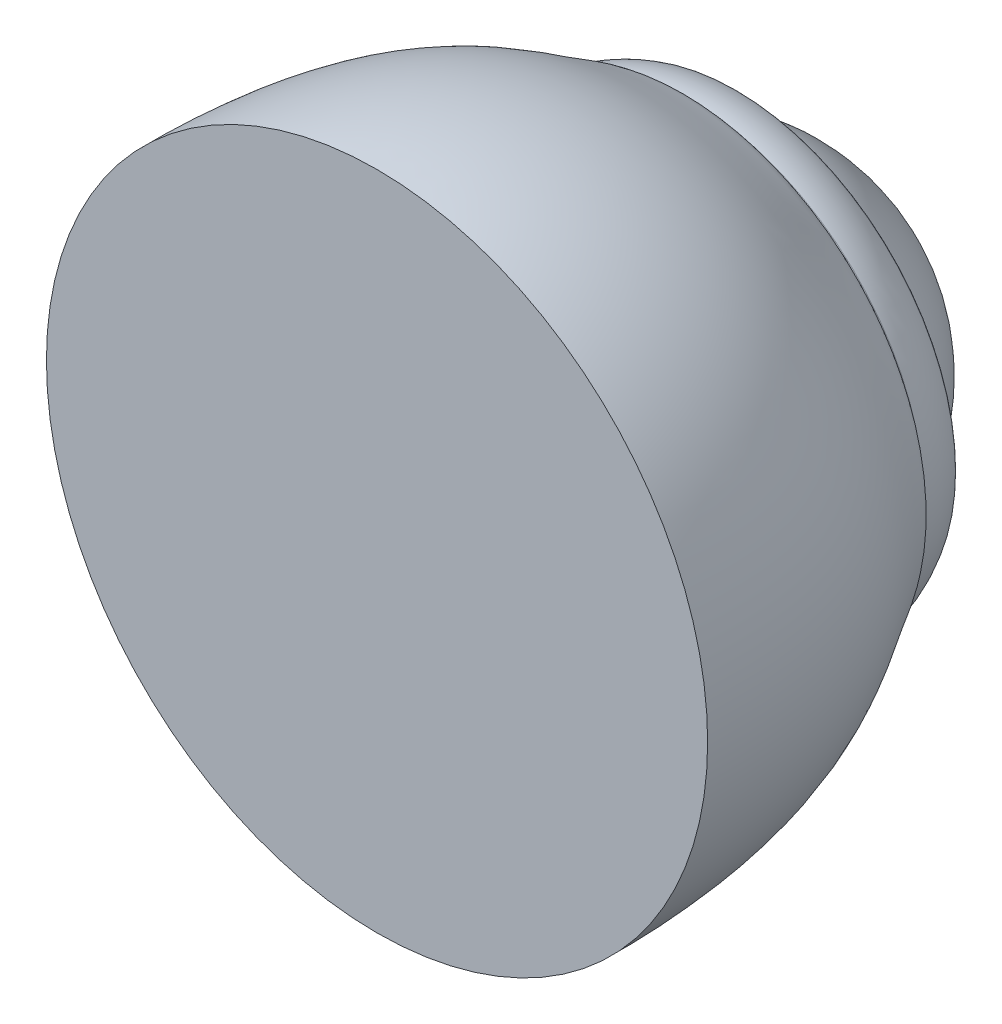
ISO-10303-21;
HEADER;
FILE_DESCRIPTION(('STEP AP214'),'2;1');
FILE_NAME('part.step','',(''),(''),'','','');
FILE_SCHEMA(('AUTOMOTIVE_DESIGN { 1 0 10303 214 1 1 1 1 }'));
ENDSEC;
DATA;
#1=APPLICATION_CONTEXT('core data for automotive mechanical design processes');
#2=APPLICATION_PROTOCOL_DEFINITION('international standard','automotive_design',2000,#1);
#3=PRODUCT_CONTEXT('',#1,'mechanical');
#4=PRODUCT('Part','Part','',(#3));
#5=PRODUCT_RELATED_PRODUCT_CATEGORY('part','',(#4));
#6=PRODUCT_DEFINITION_FORMATION('','',#4);
#7=PRODUCT_DEFINITION_CONTEXT('part definition',#1,'design');
#8=PRODUCT_DEFINITION('design','',#6,#7);
#9=PRODUCT_DEFINITION_SHAPE('','',#8);
#10=(LENGTH_UNIT() NAMED_UNIT(*) SI_UNIT(.MILLI.,.METRE.));
#11=(NAMED_UNIT(*) PLANE_ANGLE_UNIT() SI_UNIT($,.RADIAN.));
#12=(NAMED_UNIT(*) SI_UNIT($,.STERADIAN.) SOLID_ANGLE_UNIT());
#13=UNCERTAINTY_MEASURE_WITH_UNIT(LENGTH_MEASURE(1.E-05),#10,'distance_accuracy_value','');
#14=(GEOMETRIC_REPRESENTATION_CONTEXT(3) GLOBAL_UNCERTAINTY_ASSIGNED_CONTEXT((#13)) GLOBAL_UNIT_ASSIGNED_CONTEXT((#10,
#11,#12)) REPRESENTATION_CONTEXT('',''));
#15=CARTESIAN_POINT('',(0.,0.,0.));
#16=DIRECTION('',(0.,0.,1.));
#17=DIRECTION('',(1.,0.,0.));
#18=AXIS2_PLACEMENT_3D('',#15,#16,#17);
#19=CARTESIAN_POINT('',(0.,0.,-17.3445970124127));
#20=DIRECTION('',(0.,1.,0.));
#21=DIRECTION('',(-1.,0.,0.));
#22=AXIS2_PLACEMENT_3D('',#19,#20,#21);
#23=SPHERICAL_SURFACE('',#22,8.5);
#24=CARTESIAN_POINT('',(0.,8.5,-17.3445970124127));
#25=VERTEX_POINT('',#24);
#26=VERTEX_LOOP('',#25);
#27=FACE_BOUND('',#26,.T.);
#28=ADVANCED_FACE('F39',(#27),#23,.T.);
#29=CLOSED_SHELL('',(#28));
#30=MANIFOLD_SOLID_BREP('B2',#29);
#31=CARTESIAN_POINT('',(14.5,0.,-4.04459701241271));
#32=CARTESIAN_POINT('',(14.5,0.,-15.1590909090909));
#33=CARTESIAN_POINT('',(10.9220779220779,0.,-15.1590909090909));
#34=CARTESIAN_POINT('',(11.08364364155,0.,-17.5445970124127));
#35=CARTESIAN_POINT('',(10.5,0.,-17.5445970124127));
#36=B_SPLINE_CURVE_WITH_KNOTS('',4,(#31,#32,#33,#34,#35),.UNSPECIFIED.,.F.,.F.,(5,5),(0.,1.),.UNSPECIFIED.);
#37=CARTESIAN_POINT('',(0.,0.,-30.0357142857143));
#38=DIRECTION('',(0.,0.,-1.));
#39=AXIS1_PLACEMENT('',#37,#38);
#40=SURFACE_OF_REVOLUTION('',#36,#39);
#41=CARTESIAN_POINT('',(0.,0.,-17.5445970124127));
#42=DIRECTION('',(0.,0.,-1.));
#43=DIRECTION('',(-1.,0.,0.));
#44=AXIS2_PLACEMENT_3D('',#41,#42,#43);
#45=CIRCLE('',#44,10.5);
#46=CARTESIAN_POINT('',(-10.5,0.,-17.5445970124127));
#47=VERTEX_POINT('',#46);
#48=EDGE_CURVE('E78',#47,#47,#45,.T.);
#49=ORIENTED_EDGE('',*,*,#48,.F.);
#50=EDGE_LOOP('',(#49));
#51=FACE_BOUND('',#50,.T.);
#52=CARTESIAN_POINT('',(0.,0.,-4.04459701241271));
#53=DIRECTION('',(0.,0.,-1.));
#54=DIRECTION('',(-1.,0.,0.));
#55=AXIS2_PLACEMENT_3D('',#52,#53,#54);
#56=CIRCLE('',#55,14.5);
#57=CARTESIAN_POINT('',(-14.5,0.,-4.04459701241271));
#58=VERTEX_POINT('',#57);
#59=EDGE_CURVE('E72',#58,#58,#56,.T.);
#60=ORIENTED_EDGE('',*,*,#59,.T.);
#61=EDGE_LOOP('',(#60));
#62=FACE_BOUND('',#61,.T.);
#63=ADVANCED_FACE('F52',(#51,#62),#40,.T.);
#64=CARTESIAN_POINT('',(14.5,0.,-4.04459701241271));
#65=DIRECTION('',(0.,0.,-1.));
#66=DIRECTION('',(-1.,0.,0.));
#67=AXIS2_PLACEMENT_3D('',#64,#65,#66);
#68=PLANE('',#67);
#69=ORIENTED_EDGE('',*,*,#59,.F.);
#70=EDGE_LOOP('',(#69));
#71=FACE_BOUND('',#70,.T.);
#72=ADVANCED_FACE('F96',(#71),#68,.F.);
#73=CARTESIAN_POINT('',(9.6,0.,-19.8445970124127));
#74=DIRECTION('',(0.,0.,1.));
#75=DIRECTION('',(1.,0.,0.));
#76=AXIS2_PLACEMENT_3D('',#73,#74,#75);
#77=PLANE('',#76);
#78=CARTESIAN_POINT('',(0.,0.,-19.8445970124127));
#79=DIRECTION('',(0.,0.,1.));
#80=DIRECTION('',(1.,0.,0.));
#81=AXIS2_PLACEMENT_3D('',#78,#79,#80);
#82=CIRCLE('',#81,8.05140383008803);
#83=CARTESIAN_POINT('',(8.05140383008803,0.,-19.8445970124127));
#84=VERTEX_POINT('',#83);
#85=EDGE_CURVE('E38',#84,#84,#82,.T.);
#86=ORIENTED_EDGE('',*,*,#85,.T.);
#87=EDGE_LOOP('',(#86));
#88=FACE_BOUND('',#87,.T.);
#89=CARTESIAN_POINT('',(0.,0.,-19.8445970124127));
#90=DIRECTION('',(0.,0.,1.));
#91=DIRECTION('',(1.,0.,0.));
#92=AXIS2_PLACEMENT_3D('',#89,#90,#91);
#93=CIRCLE('',#92,9.49032495343306);
#94=CARTESIAN_POINT('',(9.49032495343306,0.,-19.8445970124127));
#95=VERTEX_POINT('',#94);
#96=EDGE_CURVE('E67',#95,#95,#93,.F.);
#97=ORIENTED_EDGE('',*,*,#96,.T.);
#98=EDGE_LOOP('',(#97));
#99=FACE_BOUND('',#98,.T.);
#100=ADVANCED_FACE('F115',(#88,#99),#77,.F.);
#101=CARTESIAN_POINT('',(0.,0.,-17.8445970124127));
#102=DIRECTION('',(0.,0.,-1.));
#103=DIRECTION('',(-1.,0.,0.));
#104=AXIS2_PLACEMENT_3D('',#101,#102,#103);
#105=TOROIDAL_SURFACE('',#104,6.56666666666656,3.63333333333344);
#106=CARTESIAN_POINT('',(0.,0.,-19.7494513813447));
#107=DIRECTION('',(0.,0.,1.));
#108=DIRECTION('',(1.,0.,0.));
#109=AXIS2_PLACEMENT_3D('',#106,#107,#108);
#110=CIRCLE('',#109,9.66063514489517);
#111=CARTESIAN_POINT('',(9.66063514489517,0.,-19.7494513813447));
#112=VERTEX_POINT('',#111);
#113=EDGE_CURVE('E63',#112,#112,#110,.T.);
#114=ORIENTED_EDGE('',*,*,#113,.T.);
#115=EDGE_LOOP('',(#114));
#116=FACE_BOUND('',#115,.T.);
#117=CARTESIAN_POINT('',(0.,0.,-17.8445970124127));
#118=DIRECTION('',(0.,0.,-1.));
#119=DIRECTION('',(-1.,0.,0.));
#120=AXIS2_PLACEMENT_3D('',#117,#118,#119);
#121=CIRCLE('',#120,10.2);
#122=CARTESIAN_POINT('',(-10.2,0.,-17.8445970124127));
#123=VERTEX_POINT('',#122);
#124=EDGE_CURVE('E75',#123,#123,#121,.T.);
#125=ORIENTED_EDGE('',*,*,#124,.T.);
#126=EDGE_LOOP('',(#125));
#127=FACE_BOUND('',#126,.T.);
#128=ADVANCED_FACE('F117',(#116,#127),#105,.T.);
#129=CARTESIAN_POINT('',(0.,0.,-17.8445970124127));
#130=DIRECTION('',(0.,0.,-1.));
#131=DIRECTION('',(-1.,0.,0.));
#132=AXIS2_PLACEMENT_3D('',#129,#130,#131);
#133=TOROIDAL_SURFACE('',#132,10.5,0.300000000000001);
#134=ORIENTED_EDGE('',*,*,#124,.F.);
#135=EDGE_LOOP('',(#134));
#136=FACE_BOUND('',#135,.T.);
#137=ORIENTED_EDGE('',*,*,#48,.T.);
#138=EDGE_LOOP('',(#137));
#139=FACE_BOUND('',#138,.T.);
#140=ADVANCED_FACE('F122',(#136,#139),#133,.F.);
#141=CARTESIAN_POINT('',(14.5,0.,-4.04459701241271));
#142=CARTESIAN_POINT('',(14.5,0.,-13.7512701691072));
#143=CARTESIAN_POINT('',(11.7710705559365,0.,-14.9807688681278));
#144=CARTESIAN_POINT('',(11.1873688020527,0.,-16.7254992249562));
#145=CARTESIAN_POINT('',(10.7573900579473,0.,-17.3490372263938));
#146=B_SPLINE_CURVE_WITH_KNOTS('',4,(#141,#142,#143,#144,#145),.UNSPECIFIED.,.F.,.F.,(5,5),(0.,
0.873334696741844),.UNSPECIFIED.);
#147=CARTESIAN_POINT('',(0.,0.,-30.0357142857143));
#148=DIRECTION('',(0.,0.,-1.));
#149=AXIS1_PLACEMENT('',#147,#148);
#150=SURFACE_OF_REVOLUTION('',#146,#149);
#151=OFFSET_SURFACE('',#150,-1.5,.F.);
#152=CARTESIAN_POINT('',(0.,0.,-16.2473460183291));
#153=DIRECTION('',(0.,0.,-1.));
#154=DIRECTION('',(-1.,0.,0.));
#155=AXIS2_PLACEMENT_3D('',#152,#153,#154);
#156=CIRCLE('',#155,9.67006671238051);
#157=CARTESIAN_POINT('',(-9.67006671238051,0.,-16.2473460183291));
#158=VERTEX_POINT('',#157);
#159=EDGE_CURVE('E81',#158,#158,#156,.T.);
#160=ORIENTED_EDGE('',*,*,#159,.T.);
#161=EDGE_LOOP('',(#160));
#162=FACE_BOUND('',#161,.T.);
#163=CARTESIAN_POINT('',(0.,0.,-5.5445970124127));
#164=DIRECTION('',(0.,0.,-1.));
#165=DIRECTION('',(-1.,0.,0.));
#166=AXIS2_PLACEMENT_3D('',#163,#164,#165);
#167=CIRCLE('',#166,12.9731300341922);
#168=CARTESIAN_POINT('',(-12.9731300341922,0.,-5.5445970124127));
#169=VERTEX_POINT('',#168);
#170=EDGE_CURVE('E148',#169,#169,#167,.T.);
#171=ORIENTED_EDGE('',*,*,#170,.F.);
#172=EDGE_LOOP('',(#171));
#173=FACE_BOUND('',#172,.T.);
#174=ADVANCED_FACE('F128',(#162,#173),#151,.F.);
#175=CARTESIAN_POINT('',(14.5,0.,-5.5445970124127));
#176=DIRECTION('',(0.,0.,-1.));
#177=DIRECTION('',(-1.,0.,0.));
#178=AXIS2_PLACEMENT_3D('',#175,#176,#177);
#179=PLANE('',#178);
#180=ORIENTED_EDGE('',*,*,#170,.T.);
#181=EDGE_LOOP('',(#180));
#182=FACE_BOUND('',#181,.T.);
#183=ADVANCED_FACE('F133',(#182),#179,.T.);
#184=CARTESIAN_POINT('',(0.,0.,-17.8445970124127));
#185=DIRECTION('',(0.,0.,-1.));
#186=DIRECTION('',(-1.,0.,0.));
#187=AXIS2_PLACEMENT_3D('',#184,#185,#186);
#188=TOROIDAL_SURFACE('',#187,6.56666666666656,2.13333333333344);
#189=CARTESIAN_POINT('',(0.,0.,-19.490311298127));
#190=DIRECTION('',(0.,0.,1.));
#191=DIRECTION('',(1.,0.,0.));
#192=AXIS2_PLACEMENT_3D('',#189,#190,#191);
#193=CIRCLE('',#192,7.9241406446519);
#194=CARTESIAN_POINT('',(7.9241406446519,0.,-19.490311298127));
#195=VERTEX_POINT('',#194);
#196=EDGE_CURVE('E59',#195,#195,#193,.F.);
#197=ORIENTED_EDGE('',*,*,#196,.T.);
#198=EDGE_LOOP('',(#197));
#199=FACE_BOUND('',#198,.T.);
#200=CARTESIAN_POINT('',(0.,0.,-17.8445970124127));
#201=DIRECTION('',(0.,0.,-1.));
#202=DIRECTION('',(-1.,0.,0.));
#203=AXIS2_PLACEMENT_3D('',#200,#201,#202);
#204=CIRCLE('',#203,8.7);
#205=CARTESIAN_POINT('',(-8.7,0.,-17.8445970124127));
#206=VERTEX_POINT('',#205);
#207=EDGE_CURVE('E149',#206,#206,#204,.T.);
#208=ORIENTED_EDGE('',*,*,#207,.F.);
#209=EDGE_LOOP('',(#208));
#210=FACE_BOUND('',#209,.T.);
#211=ADVANCED_FACE('F108',(#199,#210),#188,.F.);
#212=CARTESIAN_POINT('',(0.,0.,-17.8445970124127));
#213=DIRECTION('',(0.,0.,-1.));
#214=DIRECTION('',(-1.,0.,0.));
#215=AXIS2_PLACEMENT_3D('',#212,#213,#214);
#216=TOROIDAL_SURFACE('',#215,10.5,1.8);
#217=ORIENTED_EDGE('',*,*,#207,.T.);
#218=EDGE_LOOP('',(#217));
#219=FACE_BOUND('',#218,.T.);
#220=ORIENTED_EDGE('',*,*,#159,.F.);
#221=EDGE_LOOP('',(#220));
#222=FACE_BOUND('',#221,.T.);
#223=ADVANCED_FACE('F101',(#219,#222),#216,.T.);
#224=CARTESIAN_POINT('',(0.,0.,-19.6445970124127));
#225=DIRECTION('',(0.,0.,1.));
#226=DIRECTION('',(1.,0.,0.));
#227=AXIS2_PLACEMENT_3D('',#224,#225,#226);
#228=TOROIDAL_SURFACE('',#227,9.49032495343306,0.2);
#229=ORIENTED_EDGE('',*,*,#113,.F.);
#230=EDGE_LOOP('',(#229));
#231=FACE_BOUND('',#230,.T.);
#232=ORIENTED_EDGE('',*,*,#96,.F.);
#233=EDGE_LOOP('',(#232));
#234=FACE_BOUND('',#233,.T.);
#235=ADVANCED_FACE('F99',(#231,#234),#228,.T.);
#236=CARTESIAN_POINT('',(0.,0.,-19.6445970124127));
#237=DIRECTION('',(0.,0.,1.));
#238=DIRECTION('',(1.,0.,0.));
#239=AXIS2_PLACEMENT_3D('',#236,#237,#238);
#240=TOROIDAL_SURFACE('',#239,8.05140383008803,0.2);
#241=ORIENTED_EDGE('',*,*,#85,.F.);
#242=EDGE_LOOP('',(#241));
#243=FACE_BOUND('',#242,.T.);
#244=ORIENTED_EDGE('',*,*,#196,.F.);
#245=EDGE_LOOP('',(#244));
#246=FACE_BOUND('',#245,.T.);
#247=ADVANCED_FACE('F54',(#243,#246),#240,.T.);
#248=CLOSED_SHELL('',(#63,#72,#100,#128,#140,#174,#183,#211,#223,#235,#247));
#249=MANIFOLD_SOLID_BREP('B6',#248);
#250=ADVANCED_BREP_SHAPE_REPRESENTATION('',(#18,#30,#249),#14);
#251=SHAPE_DEFINITION_REPRESENTATION(#9,#250);
ENDSEC;
END-ISO-10303-21;
